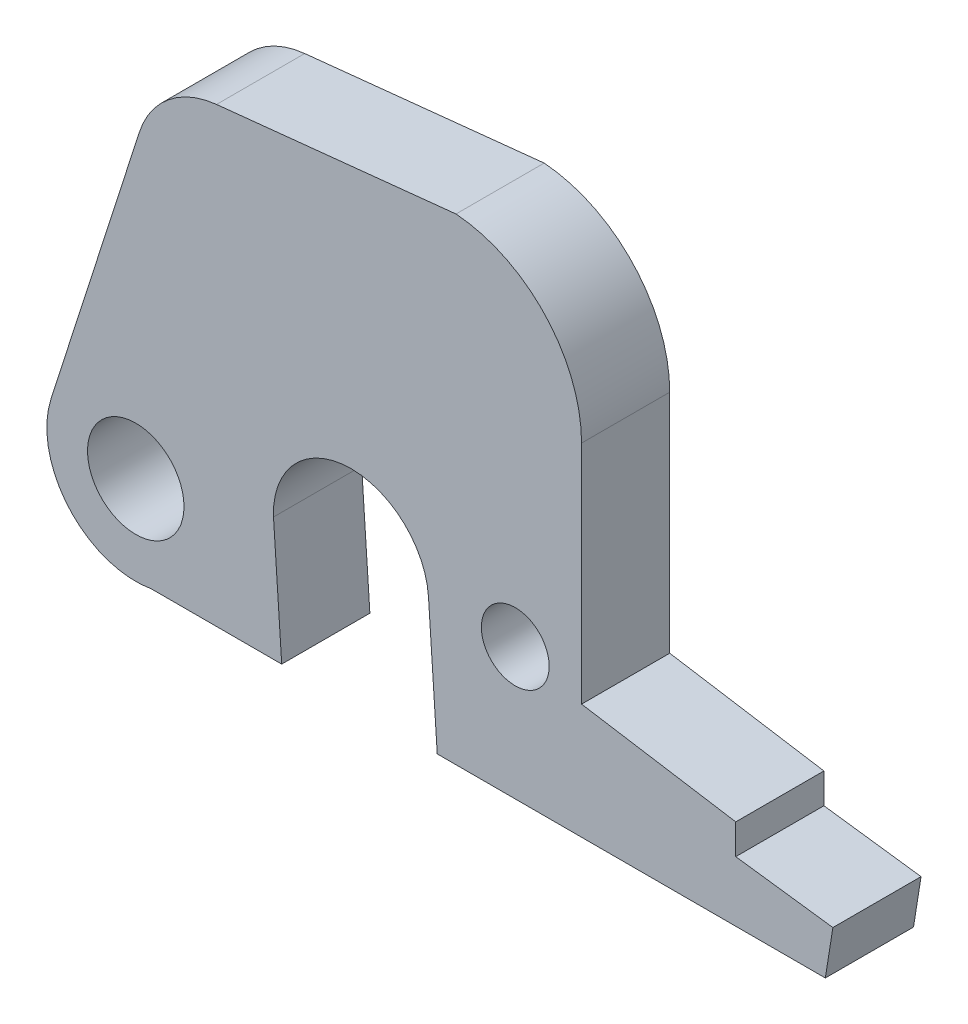
ISO-10303-21;
HEADER;
FILE_DESCRIPTION(('STEP AP214'),'2;1');
FILE_NAME('part.step','',(''),(''),'','','');
FILE_SCHEMA(('AUTOMOTIVE_DESIGN { 1 0 10303 214 1 1 1 1 }'));
ENDSEC;
DATA;
#1=APPLICATION_CONTEXT('core data for automotive mechanical design processes');
#2=APPLICATION_PROTOCOL_DEFINITION('international standard','automotive_design',2000,#1);
#3=PRODUCT_CONTEXT('',#1,'mechanical');
#4=PRODUCT('Part','Part','',(#3));
#5=PRODUCT_RELATED_PRODUCT_CATEGORY('part','',(#4));
#6=PRODUCT_DEFINITION_FORMATION('','',#4);
#7=PRODUCT_DEFINITION_CONTEXT('part definition',#1,'design');
#8=PRODUCT_DEFINITION('design','',#6,#7);
#9=PRODUCT_DEFINITION_SHAPE('','',#8);
#10=(LENGTH_UNIT() NAMED_UNIT(*) SI_UNIT(.MILLI.,.METRE.));
#11=(NAMED_UNIT(*) PLANE_ANGLE_UNIT() SI_UNIT($,.RADIAN.));
#12=(NAMED_UNIT(*) SI_UNIT($,.STERADIAN.) SOLID_ANGLE_UNIT());
#13=UNCERTAINTY_MEASURE_WITH_UNIT(LENGTH_MEASURE(1.E-05),#10,'distance_accuracy_value','');
#14=(GEOMETRIC_REPRESENTATION_CONTEXT(3) GLOBAL_UNCERTAINTY_ASSIGNED_CONTEXT((#13)) GLOBAL_UNIT_ASSIGNED_CONTEXT((#10,
#11,#12)) REPRESENTATION_CONTEXT('',''));
#15=CARTESIAN_POINT('',(0.,0.,0.));
#16=DIRECTION('',(0.,0.,1.));
#17=DIRECTION('',(1.,0.,0.));
#18=AXIS2_PLACEMENT_3D('',#15,#16,#17);
#19=CARTESIAN_POINT('',(-1.23620593143182,-5.65941247394212,1.4859));
#20=DIRECTION('',(0.,0.,1.));
#21=DIRECTION('',(1.,0.,0.));
#22=AXIS2_PLACEMENT_3D('',#19,#20,#21);
#23=PLANE('',#22);
#24=CARTESIAN_POINT('',(-8.49301630274746,-6.96993359020735,1.4859));
#25=DIRECTION('',(0.,0.,1.));
#26=DIRECTION('',(1.,0.,0.));
#27=AXIS2_PLACEMENT_3D('',#24,#25,#26);
#28=CIRCLE('',#27,1.6256);
#29=CARTESIAN_POINT('',(-6.86741630274746,-6.96993359020735,1.4859));
#30=VERTEX_POINT('',#29);
#31=EDGE_CURVE('E171',#30,#30,#28,.T.);
#32=ORIENTED_EDGE('',*,*,#31,.F.);
#33=EDGE_LOOP('',(#32));
#34=FACE_BOUND('',#33,.T.);
#35=DIRECTION('',(0.0664515565522178,-0.997789652497854,0.));
#36=VECTOR('',#35,1.);
#37=CARTESIAN_POINT('',(1.66958852630767,-9.92073691704316,1.4859));
#38=LINE('',#37,#36);
#39=CARTESIAN_POINT('',(1.37421135743306,-5.48556191169021,1.4859));
#40=VERTEX_POINT('',#39);
#41=CARTESIAN_POINT('',(1.66958852630767,-9.92073691704316,1.4859));
#42=VERTEX_POINT('',#41);
#43=EDGE_CURVE('E196',#40,#42,#38,.T.);
#44=ORIENTED_EDGE('',*,*,#43,.T.);
#45=DIRECTION('',(1.,0.,0.));
#46=VECTOR('',#45,1.);
#47=CARTESIAN_POINT('',(1.66958852630767,-9.92073691704316,1.4859));
#48=LINE('',#47,#46);
#49=CARTESIAN_POINT('',(14.7505885263077,-9.92073691704316,1.4859));
#50=VERTEX_POINT('',#49);
#51=EDGE_CURVE('E109',#42,#50,#48,.T.);
#52=ORIENTED_EDGE('',*,*,#51,.T.);
#53=DIRECTION('',(0.156767544200709,0.987635528464463,0.));
#54=VECTOR('',#53,1.);
#55=CARTESIAN_POINT('',(14.7505885263077,-9.92073691704316,1.4859));
#56=LINE('',#55,#54);
#57=CARTESIAN_POINT('',(15.0045885263077,-8.32053691704316,1.4859));
#58=VERTEX_POINT('',#57);
#59=EDGE_CURVE('E232',#50,#58,#56,.T.);
#60=ORIENTED_EDGE('',*,*,#59,.T.);
#61=DIRECTION('',(-0.99141388324305,0.130761279104084,0.));
#62=VECTOR('',#61,1.);
#63=CARTESIAN_POINT('',(15.0045885263077,-8.32053691704316,1.4859));
#64=LINE('',#63,#62);
#65=CARTESIAN_POINT('',(11.7307408114685,-7.88873691704316,1.4859));
#66=VERTEX_POINT('',#65);
#67=EDGE_CURVE('E251',#58,#66,#64,.T.);
#68=ORIENTED_EDGE('',*,*,#67,.T.);
#69=DIRECTION('',(0.,1.,0.));
#70=VECTOR('',#69,1.);
#71=CARTESIAN_POINT('',(11.7307408114685,-7.88873691704316,1.4859));
#72=LINE('',#71,#70);
#73=CARTESIAN_POINT('',(11.7307408114685,-6.87273691704316,1.4859));
#74=VERTEX_POINT('',#73);
#75=EDGE_CURVE('E248',#66,#74,#72,.T.);
#76=ORIENTED_EDGE('',*,*,#75,.T.);
#77=DIRECTION('',(-0.987241089858923,0.159232630117595,0.));
#78=VECTOR('',#77,1.);
#79=CARTESIAN_POINT('',(11.7307408114685,-6.87273691704316,1.4859));
#80=LINE('',#79,#78);
#81=CARTESIAN_POINT('',(6.53390721706875,-6.03453691704316,1.4859));
#82=VERTEX_POINT('',#81);
#83=EDGE_CURVE('E250',#74,#82,#80,.T.);
#84=ORIENTED_EDGE('',*,*,#83,.T.);
#85=DIRECTION('',(0.,1.,0.));
#86=VECTOR('',#85,1.);
#87=CARTESIAN_POINT('',(6.53390721706875,-6.03453691704316,1.4859));
#88=LINE('',#87,#86);
#89=CARTESIAN_POINT('',(6.53390721706875,1.58546308295684,1.4859));
#90=VERTEX_POINT('',#89);
#91=EDGE_CURVE('E253',#82,#90,#88,.T.);
#92=ORIENTED_EDGE('',*,*,#91,.T.);
#93=CARTESIAN_POINT('',(1.94827208508378,1.58546308295684,1.4859));
#94=DIRECTION('',(0.,0.,1.));
#95=DIRECTION('',(1.,0.,0.));
#96=AXIS2_PLACEMENT_3D('',#93,#94,#95);
#97=CIRCLE('',#96,4.58563513198498);
#98=CARTESIAN_POINT('',(2.30163530288507,6.15746308295684,1.4859));
#99=VERTEX_POINT('',#98);
#100=EDGE_CURVE('E259',#90,#99,#97,.T.);
#101=ORIENTED_EDGE('',*,*,#100,.T.);
#102=DIRECTION('',(-0.994652091225226,-0.103282222193776,0.));
#103=VECTOR('',#102,1.);
#104=CARTESIAN_POINT('',(2.30163530288507,6.15746308295684,1.4859));
#105=LINE('',#104,#103);
#106=CARTESIAN_POINT('',(-5.77059015040525,5.31926308295683,1.4859));
#107=VERTEX_POINT('',#106);
#108=EDGE_CURVE('E261',#99,#107,#105,.T.);
#109=ORIENTED_EDGE('',*,*,#108,.T.);
#110=CARTESIAN_POINT('',(-5.45413095411571,2.27162531247704,1.4859));
#111=DIRECTION('',(0.,0.,1.));
#112=DIRECTION('',(1.,0.,0.));
#113=AXIS2_PLACEMENT_3D('',#110,#111,#112);
#114=CIRCLE('',#113,3.06402389073115);
#115=CARTESIAN_POINT('',(-8.37133495275812,3.20872895310384,1.4859));
#116=VERTEX_POINT('',#115);
#117=EDGE_CURVE('E263',#107,#116,#114,.T.);
#118=ORIENTED_EDGE('',*,*,#117,.T.);
#119=DIRECTION('',(-0.305840840034436,-0.952082654272743,0.));
#120=VECTOR('',#119,1.);
#121=CARTESIAN_POINT('',(-8.37133495275813,3.20872895310384,1.4859));
#122=LINE('',#121,#120);
#123=CARTESIAN_POINT('',(-11.3465984341337,-6.05326742445613,1.4859));
#124=VERTEX_POINT('',#123);
#125=EDGE_CURVE('E265',#116,#124,#122,.T.);
#126=ORIENTED_EDGE('',*,*,#125,.T.);
#127=CARTESIAN_POINT('',(-8.49301630274746,-6.96993359020735,1.4859));
#128=DIRECTION('',(0.,0.,1.));
#129=DIRECTION('',(1.,0.,0.));
#130=AXIS2_PLACEMENT_3D('',#127,#128,#129);
#131=CIRCLE('',#130,2.9972);
#132=CARTESIAN_POINT('',(-7.96769015040525,-9.92073691704316,1.4859));
#133=VERTEX_POINT('',#132);
#134=EDGE_CURVE('E149',#124,#133,#131,.T.);
#135=ORIENTED_EDGE('',*,*,#134,.T.);
#136=DIRECTION('',(1.,0.,0.));
#137=VECTOR('',#136,1.);
#138=CARTESIAN_POINT('',(-7.96769015040524,-9.92073691704316,1.4859));
#139=LINE('',#138,#137);
#140=CARTESIAN_POINT('',(-3.57349015040525,-9.92073691704316,1.4859));
#141=VERTEX_POINT('',#140);
#142=EDGE_CURVE('E143',#133,#141,#139,.T.);
#143=ORIENTED_EDGE('',*,*,#142,.T.);
#144=DIRECTION('',(-0.0664515565522176,0.997789652497854,0.));
#145=VECTOR('',#144,1.);
#146=CARTESIAN_POINT('',(-3.85030075437916,-5.7643443405981,1.4859));
#147=LINE('',#146,#145);
#148=CARTESIAN_POINT('',(-3.85030075437916,-5.7643443405981,1.4859));
#149=VERTEX_POINT('',#148);
#150=EDGE_CURVE('E147',#141,#149,#147,.T.);
#151=ORIENTED_EDGE('',*,*,#150,.T.);
#152=CARTESIAN_POINT('',(-1.23620593143182,-5.65941247394212,1.4859));
#153=DIRECTION('',(0.,0.,-1.));
#154=DIRECTION('',(1.,0.,0.));
#155=AXIS2_PLACEMENT_3D('',#152,#153,#154);
#156=CIRCLE('',#155,2.6162);
#157=EDGE_CURVE('E45',#149,#40,#156,.T.);
#158=ORIENTED_EDGE('',*,*,#157,.T.);
#159=EDGE_LOOP('',(#44,#52,#60,#68,#76,#84,#92,#101,#109,#118,#126,#135,#143,#151,#158));
#160=FACE_BOUND('',#159,.T.);
#161=CARTESIAN_POINT('',(4.29870721706875,-5.47573691704316,1.4859));
#162=DIRECTION('',(0.,0.,1.));
#163=DIRECTION('',(1.,0.,0.));
#164=AXIS2_PLACEMENT_3D('',#161,#162,#163);
#165=CIRCLE('',#164,1.143);
#166=CARTESIAN_POINT('',(5.44170721706875,-5.47573691704316,1.4859));
#167=VERTEX_POINT('',#166);
#168=EDGE_CURVE('E308',#167,#167,#165,.T.);
#169=ORIENTED_EDGE('',*,*,#168,.F.);
#170=EDGE_LOOP('',(#169));
#171=FACE_BOUND('',#170,.T.);
#172=ADVANCED_FACE('F28',(#34,#160,#171),#23,.T.);
#173=CARTESIAN_POINT('',(-1.23620593143182,-5.65941247394212,-1.4859));
#174=DIRECTION('',(0.,0.,1.));
#175=DIRECTION('',(1.,0.,0.));
#176=AXIS2_PLACEMENT_3D('',#173,#174,#175);
#177=PLANE('',#176);
#178=CARTESIAN_POINT('',(-8.49301630274746,-6.96993359020735,-1.4859));
#179=DIRECTION('',(0.,0.,1.));
#180=DIRECTION('',(1.,0.,0.));
#181=AXIS2_PLACEMENT_3D('',#178,#179,#180);
#182=CIRCLE('',#181,1.6256);
#183=CARTESIAN_POINT('',(-6.86741630274746,-6.96993359020735,-1.4859));
#184=VERTEX_POINT('',#183);
#185=EDGE_CURVE('E313',#184,#184,#182,.T.);
#186=ORIENTED_EDGE('',*,*,#185,.T.);
#187=EDGE_LOOP('',(#186));
#188=FACE_BOUND('',#187,.T.);
#189=DIRECTION('',(0.0664515565522178,-0.997789652497854,0.));
#190=VECTOR('',#189,1.);
#191=CARTESIAN_POINT('',(1.66958852630767,-9.92073691704316,-1.4859));
#192=LINE('',#191,#190);
#193=CARTESIAN_POINT('',(1.37421135743306,-5.48556191169021,-1.4859));
#194=VERTEX_POINT('',#193);
#195=CARTESIAN_POINT('',(1.66958852630767,-9.92073691704316,-1.4859));
#196=VERTEX_POINT('',#195);
#197=EDGE_CURVE('E167',#194,#196,#192,.T.);
#198=ORIENTED_EDGE('',*,*,#197,.F.);
#199=CARTESIAN_POINT('',(-1.23620593143182,-5.65941247394212,-1.4859));
#200=DIRECTION('',(0.,0.,-1.));
#201=DIRECTION('',(1.,0.,0.));
#202=AXIS2_PLACEMENT_3D('',#199,#200,#201);
#203=CIRCLE('',#202,2.6162);
#204=CARTESIAN_POINT('',(-3.85030075437916,-5.7643443405981,-1.4859));
#205=VERTEX_POINT('',#204);
#206=EDGE_CURVE('E101',#205,#194,#203,.T.);
#207=ORIENTED_EDGE('',*,*,#206,.F.);
#208=DIRECTION('',(-0.0664515565522176,0.997789652497854,0.));
#209=VECTOR('',#208,1.);
#210=CARTESIAN_POINT('',(-3.85030075437916,-5.7643443405981,-1.4859));
#211=LINE('',#210,#209);
#212=CARTESIAN_POINT('',(-3.57349015040525,-9.92073691704316,-1.4859));
#213=VERTEX_POINT('',#212);
#214=EDGE_CURVE('E95',#213,#205,#211,.T.);
#215=ORIENTED_EDGE('',*,*,#214,.F.);
#216=DIRECTION('',(1.,0.,0.));
#217=VECTOR('',#216,1.);
#218=CARTESIAN_POINT('',(-7.96769015040524,-9.92073691704316,-1.4859));
#219=LINE('',#218,#217);
#220=CARTESIAN_POINT('',(-7.96769015040525,-9.92073691704316,-1.4859));
#221=VERTEX_POINT('',#220);
#222=EDGE_CURVE('E157',#221,#213,#219,.T.);
#223=ORIENTED_EDGE('',*,*,#222,.F.);
#224=CARTESIAN_POINT('',(-8.49301630274746,-6.96993359020735,-1.4859));
#225=DIRECTION('',(0.,0.,1.));
#226=DIRECTION('',(1.,0.,0.));
#227=AXIS2_PLACEMENT_3D('',#224,#225,#226);
#228=CIRCLE('',#227,2.9972);
#229=CARTESIAN_POINT('',(-11.3465984341337,-6.05326742445613,-1.4859));
#230=VERTEX_POINT('',#229);
#231=EDGE_CURVE('E191',#230,#221,#228,.T.);
#232=ORIENTED_EDGE('',*,*,#231,.F.);
#233=DIRECTION('',(-0.305840840034436,-0.952082654272743,0.));
#234=VECTOR('',#233,1.);
#235=CARTESIAN_POINT('',(-8.37133495275813,3.20872895310384,-1.4859));
#236=LINE('',#235,#234);
#237=CARTESIAN_POINT('',(-8.37133495275812,3.20872895310384,-1.4859));
#238=VERTEX_POINT('',#237);
#239=EDGE_CURVE('E189',#238,#230,#236,.T.);
#240=ORIENTED_EDGE('',*,*,#239,.F.);
#241=CARTESIAN_POINT('',(-5.45413095411571,2.27162531247704,-1.4859));
#242=DIRECTION('',(0.,0.,1.));
#243=DIRECTION('',(1.,0.,0.));
#244=AXIS2_PLACEMENT_3D('',#241,#242,#243);
#245=CIRCLE('',#244,3.06402389073115);
#246=CARTESIAN_POINT('',(-5.77059015040525,5.31926308295683,-1.4859));
#247=VERTEX_POINT('',#246);
#248=EDGE_CURVE('E187',#247,#238,#245,.T.);
#249=ORIENTED_EDGE('',*,*,#248,.F.);
#250=DIRECTION('',(-0.994652091225226,-0.103282222193776,0.));
#251=VECTOR('',#250,1.);
#252=CARTESIAN_POINT('',(2.30163530288507,6.15746308295684,-1.4859));
#253=LINE('',#252,#251);
#254=CARTESIAN_POINT('',(2.30163530288507,6.15746308295684,-1.4859));
#255=VERTEX_POINT('',#254);
#256=EDGE_CURVE('E185',#255,#247,#253,.T.);
#257=ORIENTED_EDGE('',*,*,#256,.F.);
#258=CARTESIAN_POINT('',(1.94827208508378,1.58546308295684,-1.4859));
#259=DIRECTION('',(0.,0.,1.));
#260=DIRECTION('',(1.,0.,0.));
#261=AXIS2_PLACEMENT_3D('',#258,#259,#260);
#262=CIRCLE('',#261,4.58563513198498);
#263=CARTESIAN_POINT('',(6.53390721706875,1.58546308295684,-1.4859));
#264=VERTEX_POINT('',#263);
#265=EDGE_CURVE('E183',#264,#255,#262,.T.);
#266=ORIENTED_EDGE('',*,*,#265,.F.);
#267=DIRECTION('',(0.,1.,0.));
#268=VECTOR('',#267,1.);
#269=CARTESIAN_POINT('',(6.53390721706875,-6.03453691704316,-1.4859));
#270=LINE('',#269,#268);
#271=CARTESIAN_POINT('',(6.53390721706875,-6.03453691704316,-1.4859));
#272=VERTEX_POINT('',#271);
#273=EDGE_CURVE('E181',#272,#264,#270,.T.);
#274=ORIENTED_EDGE('',*,*,#273,.F.);
#275=DIRECTION('',(-0.987241089858923,0.159232630117595,0.));
#276=VECTOR('',#275,1.);
#277=CARTESIAN_POINT('',(11.7307408114685,-6.87273691704316,-1.4859));
#278=LINE('',#277,#276);
#279=CARTESIAN_POINT('',(11.7307408114685,-6.87273691704316,-1.4859));
#280=VERTEX_POINT('',#279);
#281=EDGE_CURVE('E179',#280,#272,#278,.T.);
#282=ORIENTED_EDGE('',*,*,#281,.F.);
#283=DIRECTION('',(0.,1.,0.));
#284=VECTOR('',#283,1.);
#285=CARTESIAN_POINT('',(11.7307408114685,-7.88873691704316,-1.4859));
#286=LINE('',#285,#284);
#287=CARTESIAN_POINT('',(11.7307408114685,-7.88873691704316,-1.4859));
#288=VERTEX_POINT('',#287);
#289=EDGE_CURVE('E177',#288,#280,#286,.T.);
#290=ORIENTED_EDGE('',*,*,#289,.F.);
#291=DIRECTION('',(-0.99141388324305,0.130761279104084,0.));
#292=VECTOR('',#291,1.);
#293=CARTESIAN_POINT('',(15.0045885263077,-8.32053691704316,-1.4859));
#294=LINE('',#293,#292);
#295=CARTESIAN_POINT('',(15.0045885263077,-8.32053691704316,-1.4859));
#296=VERTEX_POINT('',#295);
#297=EDGE_CURVE('E175',#296,#288,#294,.T.);
#298=ORIENTED_EDGE('',*,*,#297,.F.);
#299=DIRECTION('',(0.156767544200709,0.987635528464463,0.));
#300=VECTOR('',#299,1.);
#301=CARTESIAN_POINT('',(14.7505885263077,-9.92073691704316,-1.4859));
#302=LINE('',#301,#300);
#303=CARTESIAN_POINT('',(14.7505885263077,-9.92073691704316,-1.4859));
#304=VERTEX_POINT('',#303);
#305=EDGE_CURVE('E173',#304,#296,#302,.T.);
#306=ORIENTED_EDGE('',*,*,#305,.F.);
#307=DIRECTION('',(1.,0.,0.));
#308=VECTOR('',#307,1.);
#309=CARTESIAN_POINT('',(1.66958852630767,-9.92073691704316,-1.4859));
#310=LINE('',#309,#308);
#311=EDGE_CURVE('E170',#196,#304,#310,.T.);
#312=ORIENTED_EDGE('',*,*,#311,.F.);
#313=EDGE_LOOP('',(#198,#207,#215,#223,#232,#240,#249,#257,#266,#274,#282,#290,#298,#306,#312));
#314=FACE_BOUND('',#313,.T.);
#315=CARTESIAN_POINT('',(4.29870721706875,-5.47573691704316,-1.4859));
#316=DIRECTION('',(0.,0.,1.));
#317=DIRECTION('',(1.,0.,0.));
#318=AXIS2_PLACEMENT_3D('',#315,#316,#317);
#319=CIRCLE('',#318,1.143);
#320=CARTESIAN_POINT('',(5.44170721706875,-5.47573691704316,-1.4859));
#321=VERTEX_POINT('',#320);
#322=EDGE_CURVE('E311',#321,#321,#319,.T.);
#323=ORIENTED_EDGE('',*,*,#322,.T.);
#324=EDGE_LOOP('',(#323));
#325=FACE_BOUND('',#324,.T.);
#326=ADVANCED_FACE('F236',(#188,#314,#325),#177,.F.);
#327=CARTESIAN_POINT('',(1.66958852630767,-9.92073691704316,1.4859));
#328=DIRECTION('',(0.997789652497854,0.0664515565522178,0.));
#329=DIRECTION('',(-0.0664515565522178,0.997789652497854,0.));
#330=AXIS2_PLACEMENT_3D('',#327,#328,#329);
#331=PLANE('',#330);
#332=ORIENTED_EDGE('',*,*,#197,.T.);
#333=DIRECTION('',(0.,0.,-1.));
#334=VECTOR('',#333,1.);
#335=CARTESIAN_POINT('',(1.66958852630767,-9.92073691704316,1.4859));
#336=LINE('',#335,#334);
#337=EDGE_CURVE('E11',#42,#196,#336,.T.);
#338=ORIENTED_EDGE('',*,*,#337,.F.);
#339=ORIENTED_EDGE('',*,*,#43,.F.);
#340=DIRECTION('',(0.,0.,-1.));
#341=VECTOR('',#340,1.);
#342=CARTESIAN_POINT('',(1.37421135743306,-5.48556191169021,1.4859));
#343=LINE('',#342,#341);
#344=EDGE_CURVE('E163',#40,#194,#343,.T.);
#345=ORIENTED_EDGE('',*,*,#344,.T.);
#346=EDGE_LOOP('',(#332,#338,#339,#345));
#347=FACE_BOUND('',#346,.T.);
#348=ADVANCED_FACE('F30',(#347),#331,.F.);
#349=CARTESIAN_POINT('',(1.66958852630767,-9.92073691704316,1.4859));
#350=DIRECTION('',(0.,1.,0.));
#351=DIRECTION('',(0.,0.,1.));
#352=AXIS2_PLACEMENT_3D('',#349,#350,#351);
#353=PLANE('',#352);
#354=ORIENTED_EDGE('',*,*,#311,.T.);
#355=DIRECTION('',(0.,0.,-1.));
#356=VECTOR('',#355,1.);
#357=CARTESIAN_POINT('',(14.7505885263077,-9.92073691704316,1.4859));
#358=LINE('',#357,#356);
#359=EDGE_CURVE('E37',#50,#304,#358,.T.);
#360=ORIENTED_EDGE('',*,*,#359,.F.);
#361=ORIENTED_EDGE('',*,*,#51,.F.);
#362=ORIENTED_EDGE('',*,*,#337,.T.);
#363=EDGE_LOOP('',(#354,#360,#361,#362));
#364=FACE_BOUND('',#363,.T.);
#365=ADVANCED_FACE('F436',(#364),#353,.F.);
#366=CARTESIAN_POINT('',(14.7505885263077,-9.92073691704316,1.4859));
#367=DIRECTION('',(-0.987635528464463,0.156767544200709,0.));
#368=DIRECTION('',(-0.156767544200709,-0.987635528464463,0.));
#369=AXIS2_PLACEMENT_3D('',#366,#367,#368);
#370=PLANE('',#369);
#371=ORIENTED_EDGE('',*,*,#305,.T.);
#372=DIRECTION('',(0.,0.,-1.));
#373=VECTOR('',#372,1.);
#374=CARTESIAN_POINT('',(15.0045885263077,-8.32053691704316,1.4859));
#375=LINE('',#374,#373);
#376=EDGE_CURVE('E224',#58,#296,#375,.T.);
#377=ORIENTED_EDGE('',*,*,#376,.F.);
#378=ORIENTED_EDGE('',*,*,#59,.F.);
#379=ORIENTED_EDGE('',*,*,#359,.T.);
#380=EDGE_LOOP('',(#371,#377,#378,#379));
#381=FACE_BOUND('',#380,.T.);
#382=ADVANCED_FACE('F230',(#381),#370,.F.);
#383=CARTESIAN_POINT('',(15.0045885263077,-8.32053691704316,1.4859));
#384=DIRECTION('',(-0.130761279104084,-0.99141388324305,0.));
#385=DIRECTION('',(0.99141388324305,-0.130761279104084,0.));
#386=AXIS2_PLACEMENT_3D('',#383,#384,#385);
#387=PLANE('',#386);
#388=ORIENTED_EDGE('',*,*,#297,.T.);
#389=DIRECTION('',(0.,0.,-1.));
#390=VECTOR('',#389,1.);
#391=CARTESIAN_POINT('',(11.7307408114685,-7.88873691704316,1.4859));
#392=LINE('',#391,#390);
#393=EDGE_CURVE('E221',#66,#288,#392,.T.);
#394=ORIENTED_EDGE('',*,*,#393,.F.);
#395=ORIENTED_EDGE('',*,*,#67,.F.);
#396=ORIENTED_EDGE('',*,*,#376,.T.);
#397=EDGE_LOOP('',(#388,#394,#395,#396));
#398=FACE_BOUND('',#397,.T.);
#399=ADVANCED_FACE('F242',(#398),#387,.F.);
#400=CARTESIAN_POINT('',(11.7307408114685,-7.88873691704316,1.4859));
#401=DIRECTION('',(-1.,0.,0.));
#402=DIRECTION('',(0.,-1.,0.));
#403=AXIS2_PLACEMENT_3D('',#400,#401,#402);
#404=PLANE('',#403);
#405=ORIENTED_EDGE('',*,*,#289,.T.);
#406=DIRECTION('',(0.,0.,-1.));
#407=VECTOR('',#406,1.);
#408=CARTESIAN_POINT('',(11.7307408114685,-6.87273691704316,1.4859));
#409=LINE('',#408,#407);
#410=EDGE_CURVE('E218',#74,#280,#409,.T.);
#411=ORIENTED_EDGE('',*,*,#410,.F.);
#412=ORIENTED_EDGE('',*,*,#75,.F.);
#413=ORIENTED_EDGE('',*,*,#393,.T.);
#414=EDGE_LOOP('',(#405,#411,#412,#413));
#415=FACE_BOUND('',#414,.T.);
#416=ADVANCED_FACE('F246',(#415),#404,.F.);
#417=CARTESIAN_POINT('',(11.7307408114685,-6.87273691704316,1.4859));
#418=DIRECTION('',(-0.159232630117595,-0.987241089858923,0.));
#419=DIRECTION('',(0.987241089858923,-0.159232630117595,0.));
#420=AXIS2_PLACEMENT_3D('',#417,#418,#419);
#421=PLANE('',#420);
#422=ORIENTED_EDGE('',*,*,#281,.T.);
#423=DIRECTION('',(0.,0.,-1.));
#424=VECTOR('',#423,1.);
#425=CARTESIAN_POINT('',(6.53390721706875,-6.03453691704316,1.4859));
#426=LINE('',#425,#424);
#427=EDGE_CURVE('E215',#82,#272,#426,.T.);
#428=ORIENTED_EDGE('',*,*,#427,.F.);
#429=ORIENTED_EDGE('',*,*,#83,.F.);
#430=ORIENTED_EDGE('',*,*,#410,.T.);
#431=EDGE_LOOP('',(#422,#428,#429,#430));
#432=FACE_BOUND('',#431,.T.);
#433=ADVANCED_FACE('F401',(#432),#421,.F.);
#434=CARTESIAN_POINT('',(6.53390721706875,-6.03453691704316,1.4859));
#435=DIRECTION('',(-1.,0.,0.));
#436=DIRECTION('',(0.,0.,1.));
#437=AXIS2_PLACEMENT_3D('',#434,#435,#436);
#438=PLANE('',#437);
#439=ORIENTED_EDGE('',*,*,#273,.T.);
#440=DIRECTION('',(0.,0.,-1.));
#441=VECTOR('',#440,1.);
#442=CARTESIAN_POINT('',(6.53390721706875,1.58546308295684,1.4859));
#443=LINE('',#442,#441);
#444=EDGE_CURVE('E212',#90,#264,#443,.T.);
#445=ORIENTED_EDGE('',*,*,#444,.F.);
#446=ORIENTED_EDGE('',*,*,#91,.F.);
#447=ORIENTED_EDGE('',*,*,#427,.T.);
#448=EDGE_LOOP('',(#439,#445,#446,#447));
#449=FACE_BOUND('',#448,.T.);
#450=ADVANCED_FACE('F391',(#449),#438,.F.);
#451=CARTESIAN_POINT('',(1.94827208508378,1.58546308295684,1.4859));
#452=DIRECTION('',(0.,0.,-1.));
#453=DIRECTION('',(-1.,0.,0.));
#454=AXIS2_PLACEMENT_3D('',#451,#452,#453);
#455=CYLINDRICAL_SURFACE('',#454,4.58563513198498);
#456=ORIENTED_EDGE('',*,*,#265,.T.);
#457=DIRECTION('',(0.,0.,-1.));
#458=VECTOR('',#457,1.);
#459=CARTESIAN_POINT('',(2.30163530288507,6.15746308295684,1.4859));
#460=LINE('',#459,#458);
#461=EDGE_CURVE('E209',#99,#255,#460,.T.);
#462=ORIENTED_EDGE('',*,*,#461,.F.);
#463=ORIENTED_EDGE('',*,*,#100,.F.);
#464=ORIENTED_EDGE('',*,*,#444,.T.);
#465=EDGE_LOOP('',(#456,#462,#463,#464));
#466=FACE_BOUND('',#465,.T.);
#467=ADVANCED_FACE('F381',(#466),#455,.T.);
#468=CARTESIAN_POINT('',(2.30163530288507,6.15746308295684,1.4859));
#469=DIRECTION('',(0.103282222193776,-0.994652091225226,0.));
#470=DIRECTION('',(0.994652091225226,0.103282222193776,0.));
#471=AXIS2_PLACEMENT_3D('',#468,#469,#470);
#472=PLANE('',#471);
#473=ORIENTED_EDGE('',*,*,#256,.T.);
#474=DIRECTION('',(0.,0.,-1.));
#475=VECTOR('',#474,1.);
#476=CARTESIAN_POINT('',(-5.77059015040525,5.31926308295683,1.4859));
#477=LINE('',#476,#475);
#478=EDGE_CURVE('E206',#107,#247,#477,.T.);
#479=ORIENTED_EDGE('',*,*,#478,.F.);
#480=ORIENTED_EDGE('',*,*,#108,.F.);
#481=ORIENTED_EDGE('',*,*,#461,.T.);
#482=EDGE_LOOP('',(#473,#479,#480,#481));
#483=FACE_BOUND('',#482,.T.);
#484=ADVANCED_FACE('F371',(#483),#472,.F.);
#485=CARTESIAN_POINT('',(-5.45413095411571,2.27162531247704,1.4859));
#486=DIRECTION('',(0.,0.,-1.));
#487=DIRECTION('',(-1.,0.,0.));
#488=AXIS2_PLACEMENT_3D('',#485,#486,#487);
#489=CYLINDRICAL_SURFACE('',#488,3.06402389073115);
#490=ORIENTED_EDGE('',*,*,#248,.T.);
#491=DIRECTION('',(0.,0.,-1.));
#492=VECTOR('',#491,1.);
#493=CARTESIAN_POINT('',(-8.37133495275812,3.20872895310384,1.4859));
#494=LINE('',#493,#492);
#495=EDGE_CURVE('E203',#116,#238,#494,.T.);
#496=ORIENTED_EDGE('',*,*,#495,.F.);
#497=ORIENTED_EDGE('',*,*,#117,.F.);
#498=ORIENTED_EDGE('',*,*,#478,.T.);
#499=EDGE_LOOP('',(#490,#496,#497,#498));
#500=FACE_BOUND('',#499,.T.);
#501=ADVANCED_FACE('F362',(#500),#489,.T.);
#502=CARTESIAN_POINT('',(-8.37133495275813,3.20872895310384,1.4859));
#503=DIRECTION('',(0.952082654272743,-0.305840840034436,0.));
#504=DIRECTION('',(0.305840840034436,0.952082654272743,0.));
#505=AXIS2_PLACEMENT_3D('',#502,#503,#504);
#506=PLANE('',#505);
#507=ORIENTED_EDGE('',*,*,#239,.T.);
#508=DIRECTION('',(0.,0.,-1.));
#509=VECTOR('',#508,1.);
#510=CARTESIAN_POINT('',(-11.3465984341337,-6.05326742445613,1.4859));
#511=LINE('',#510,#509);
#512=EDGE_CURVE('E200',#124,#230,#511,.T.);
#513=ORIENTED_EDGE('',*,*,#512,.F.);
#514=ORIENTED_EDGE('',*,*,#125,.F.);
#515=ORIENTED_EDGE('',*,*,#495,.T.);
#516=EDGE_LOOP('',(#507,#513,#514,#515));
#517=FACE_BOUND('',#516,.T.);
#518=ADVANCED_FACE('F271',(#517),#506,.F.);
#519=CARTESIAN_POINT('',(-8.49301630274746,-6.96993359020735,1.4859));
#520=DIRECTION('',(0.,0.,-1.));
#521=DIRECTION('',(-1.,0.,0.));
#522=AXIS2_PLACEMENT_3D('',#519,#520,#521);
#523=CYLINDRICAL_SURFACE('',#522,2.9972);
#524=ORIENTED_EDGE('',*,*,#231,.T.);
#525=DIRECTION('',(0.,0.,-1.));
#526=VECTOR('',#525,1.);
#527=CARTESIAN_POINT('',(-7.96769015040525,-9.92073691704316,1.4859));
#528=LINE('',#527,#526);
#529=EDGE_CURVE('E158',#133,#221,#528,.T.);
#530=ORIENTED_EDGE('',*,*,#529,.F.);
#531=ORIENTED_EDGE('',*,*,#134,.F.);
#532=ORIENTED_EDGE('',*,*,#512,.T.);
#533=EDGE_LOOP('',(#524,#530,#531,#532));
#534=FACE_BOUND('',#533,.T.);
#535=ADVANCED_FACE('F275',(#534),#523,.T.);
#536=CARTESIAN_POINT('',(-7.96769015040524,-9.92073691704316,1.4859));
#537=DIRECTION('',(0.,1.,0.));
#538=DIRECTION('',(-1.,0.,0.));
#539=AXIS2_PLACEMENT_3D('',#536,#537,#538);
#540=PLANE('',#539);
#541=ORIENTED_EDGE('',*,*,#222,.T.);
#542=DIRECTION('',(0.,0.,-1.));
#543=VECTOR('',#542,1.);
#544=CARTESIAN_POINT('',(-3.57349015040525,-9.92073691704316,1.4859));
#545=LINE('',#544,#543);
#546=EDGE_CURVE('E154',#141,#213,#545,.T.);
#547=ORIENTED_EDGE('',*,*,#546,.F.);
#548=ORIENTED_EDGE('',*,*,#142,.F.);
#549=ORIENTED_EDGE('',*,*,#529,.T.);
#550=EDGE_LOOP('',(#541,#547,#548,#549));
#551=FACE_BOUND('',#550,.T.);
#552=ADVANCED_FACE('F155',(#551),#540,.F.);
#553=CARTESIAN_POINT('',(-3.85030075437916,-5.7643443405981,1.4859));
#554=DIRECTION('',(-0.997789652497854,-0.0664515565522176,0.));
#555=DIRECTION('',(0.0664515565522176,-0.997789652497854,0.));
#556=AXIS2_PLACEMENT_3D('',#553,#554,#555);
#557=PLANE('',#556);
#558=ORIENTED_EDGE('',*,*,#214,.T.);
#559=DIRECTION('',(0.,0.,-1.));
#560=VECTOR('',#559,1.);
#561=CARTESIAN_POINT('',(-3.85030075437916,-5.7643443405981,1.4859));
#562=LINE('',#561,#560);
#563=EDGE_CURVE('E159',#149,#205,#562,.T.);
#564=ORIENTED_EDGE('',*,*,#563,.F.);
#565=ORIENTED_EDGE('',*,*,#150,.F.);
#566=ORIENTED_EDGE('',*,*,#546,.T.);
#567=EDGE_LOOP('',(#558,#564,#565,#566));
#568=FACE_BOUND('',#567,.T.);
#569=ADVANCED_FACE('F161',(#568),#557,.F.);
#570=CARTESIAN_POINT('',(-1.23620593143182,-5.65941247394212,1.4859));
#571=DIRECTION('',(0.,0.,-1.));
#572=DIRECTION('',(-1.,0.,0.));
#573=AXIS2_PLACEMENT_3D('',#570,#571,#572);
#574=CYLINDRICAL_SURFACE('',#573,2.6162);
#575=ORIENTED_EDGE('',*,*,#206,.T.);
#576=ORIENTED_EDGE('',*,*,#344,.F.);
#577=ORIENTED_EDGE('',*,*,#157,.F.);
#578=ORIENTED_EDGE('',*,*,#563,.T.);
#579=EDGE_LOOP('',(#575,#576,#577,#578));
#580=FACE_BOUND('',#579,.T.);
#581=ADVANCED_FACE('F279',(#580),#574,.F.);
#582=CARTESIAN_POINT('',(-8.49301630274746,-6.96993359020735,1.4859));
#583=DIRECTION('',(0.,0.,-1.));
#584=DIRECTION('',(-1.,0.,0.));
#585=AXIS2_PLACEMENT_3D('',#582,#583,#584);
#586=CYLINDRICAL_SURFACE('',#585,1.6256);
#587=ORIENTED_EDGE('',*,*,#31,.T.);
#588=EDGE_LOOP('',(#587));
#589=FACE_BOUND('',#588,.T.);
#590=ORIENTED_EDGE('',*,*,#185,.F.);
#591=EDGE_LOOP('',(#590));
#592=FACE_BOUND('',#591,.T.);
#593=ADVANCED_FACE('F281',(#589,#592),#586,.F.);
#594=CARTESIAN_POINT('',(4.29870721706875,-5.47573691704316,1.4859));
#595=DIRECTION('',(0.,0.,-1.));
#596=DIRECTION('',(-1.,0.,0.));
#597=AXIS2_PLACEMENT_3D('',#594,#595,#596);
#598=CYLINDRICAL_SURFACE('',#597,1.143);
#599=ORIENTED_EDGE('',*,*,#168,.T.);
#600=EDGE_LOOP('',(#599));
#601=FACE_BOUND('',#600,.T.);
#602=ORIENTED_EDGE('',*,*,#322,.F.);
#603=EDGE_LOOP('',(#602));
#604=FACE_BOUND('',#603,.T.);
#605=ADVANCED_FACE('F287',(#601,#604),#598,.F.);
#606=CLOSED_SHELL('',(#172,#326,#348,#365,#382,#399,#416,#433,#450,#467,#484,#501,#518,#535,
#552,#569,#581,#593,#605));
#607=MANIFOLD_SOLID_BREP('B2',#606);
#608=ADVANCED_BREP_SHAPE_REPRESENTATION('',(#18,#607),#14);
#609=SHAPE_DEFINITION_REPRESENTATION(#9,#608);
ENDSEC;
END-ISO-10303-21;
